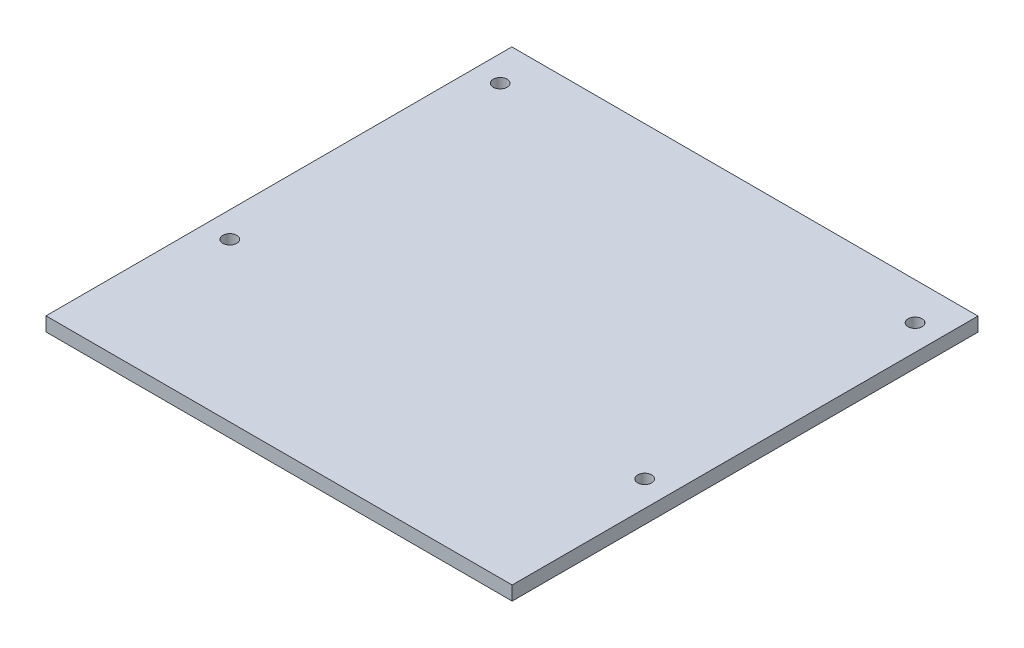
ISO-10303-21;
HEADER;
FILE_DESCRIPTION(('STEP AP214'),'2;1');
FILE_NAME('part.step','',(''),(''),'','','');
FILE_SCHEMA(('AUTOMOTIVE_DESIGN { 1 0 10303 214 1 1 1 1 }'));
ENDSEC;
DATA;
#1=APPLICATION_CONTEXT('core data for automotive mechanical design processes');
#2=APPLICATION_PROTOCOL_DEFINITION('international standard','automotive_design',2000,#1);
#3=PRODUCT_CONTEXT('',#1,'mechanical');
#4=PRODUCT('Part','Part','',(#3));
#5=PRODUCT_RELATED_PRODUCT_CATEGORY('part','',(#4));
#6=PRODUCT_DEFINITION_FORMATION('','',#4);
#7=PRODUCT_DEFINITION_CONTEXT('part definition',#1,'design');
#8=PRODUCT_DEFINITION('design','',#6,#7);
#9=PRODUCT_DEFINITION_SHAPE('','',#8);
#10=(LENGTH_UNIT() NAMED_UNIT(*) SI_UNIT(.MILLI.,.METRE.));
#11=(NAMED_UNIT(*) PLANE_ANGLE_UNIT() SI_UNIT($,.RADIAN.));
#12=(NAMED_UNIT(*) SI_UNIT($,.STERADIAN.) SOLID_ANGLE_UNIT());
#13=UNCERTAINTY_MEASURE_WITH_UNIT(LENGTH_MEASURE(1.E-05),#10,'distance_accuracy_value','');
#14=(GEOMETRIC_REPRESENTATION_CONTEXT(3) GLOBAL_UNCERTAINTY_ASSIGNED_CONTEXT((#13)) GLOBAL_UNIT_ASSIGNED_CONTEXT((#10,
#11,#12)) REPRESENTATION_CONTEXT('',''));
#15=CARTESIAN_POINT('',(0.,0.,0.));
#16=DIRECTION('',(0.,0.,1.));
#17=DIRECTION('',(1.,0.,0.));
#18=AXIS2_PLACEMENT_3D('',#15,#16,#17);
#19=CARTESIAN_POINT('',(-50.,3.,0.));
#20=DIRECTION('',(-1.,0.,0.));
#21=DIRECTION('',(0.,0.,1.));
#22=AXIS2_PLACEMENT_3D('',#19,#20,#21);
#23=PLANE('',#22);
#24=DIRECTION('',(0.,0.,-1.));
#25=VECTOR('',#24,1.);
#26=CARTESIAN_POINT('',(-50.,0.,0.));
#27=LINE('',#26,#25);
#28=CARTESIAN_POINT('',(-50.,0.,4.46357158762531));
#29=VERTEX_POINT('',#28);
#30=CARTESIAN_POINT('',(-50.,0.,-95.4635715876253));
#31=VERTEX_POINT('',#30);
#32=EDGE_CURVE('E109',#29,#31,#27,.T.);
#33=ORIENTED_EDGE('',*,*,#32,.F.);
#34=DIRECTION('',(0.,-1.,0.));
#35=VECTOR('',#34,1.);
#36=CARTESIAN_POINT('',(-50.,3.,4.46357158762531));
#37=LINE('',#36,#35);
#38=CARTESIAN_POINT('',(-50.,3.,4.46357158762531));
#39=VERTEX_POINT('',#38);
#40=EDGE_CURVE('E11',#39,#29,#37,.T.);
#41=ORIENTED_EDGE('',*,*,#40,.F.);
#42=DIRECTION('',(0.,0.,-1.));
#43=VECTOR('',#42,1.);
#44=CARTESIAN_POINT('',(-50.,3.,0.));
#45=LINE('',#44,#43);
#46=CARTESIAN_POINT('',(-50.,3.,-95.4635715876253));
#47=VERTEX_POINT('',#46);
#48=EDGE_CURVE('E102',#39,#47,#45,.T.);
#49=ORIENTED_EDGE('',*,*,#48,.T.);
#50=DIRECTION('',(0.,1.,0.));
#51=VECTOR('',#50,1.);
#52=CARTESIAN_POINT('',(-50.,0.,-95.4635715876253));
#53=LINE('',#52,#51);
#54=EDGE_CURVE('E114',#31,#47,#53,.T.);
#55=ORIENTED_EDGE('',*,*,#54,.F.);
#56=EDGE_LOOP('',(#33,#41,#49,#55));
#57=FACE_BOUND('',#56,.T.);
#58=ADVANCED_FACE('F51',(#57),#23,.T.);
#59=CARTESIAN_POINT('',(0.,3.,4.46357158762531));
#60=DIRECTION('',(0.,0.,-1.));
#61=DIRECTION('',(-1.,0.,0.));
#62=AXIS2_PLACEMENT_3D('',#59,#60,#61);
#63=PLANE('',#62);
#64=DIRECTION('',(1.,0.,0.));
#65=VECTOR('',#64,1.);
#66=CARTESIAN_POINT('',(0.,0.,4.46357158762531));
#67=LINE('',#66,#65);
#68=CARTESIAN_POINT('',(50.,0.,4.46357158762531));
#69=VERTEX_POINT('',#68);
#70=EDGE_CURVE('E103',#29,#69,#67,.T.);
#71=ORIENTED_EDGE('',*,*,#70,.T.);
#72=DIRECTION('',(0.,-1.,0.));
#73=VECTOR('',#72,1.);
#74=CARTESIAN_POINT('',(50.,3.,4.46357158762531));
#75=LINE('',#74,#73);
#76=CARTESIAN_POINT('',(50.,3.,4.46357158762531));
#77=VERTEX_POINT('',#76);
#78=EDGE_CURVE('E60',#77,#69,#75,.T.);
#79=ORIENTED_EDGE('',*,*,#78,.F.);
#80=DIRECTION('',(1.,0.,0.));
#81=VECTOR('',#80,1.);
#82=CARTESIAN_POINT('',(0.,3.,4.46357158762531));
#83=LINE('',#82,#81);
#84=EDGE_CURVE('E68',#39,#77,#83,.T.);
#85=ORIENTED_EDGE('',*,*,#84,.F.);
#86=ORIENTED_EDGE('',*,*,#40,.T.);
#87=EDGE_LOOP('',(#71,#79,#85,#86));
#88=FACE_BOUND('',#87,.T.);
#89=ADVANCED_FACE('F216',(#88),#63,.F.);
#90=CARTESIAN_POINT('',(50.,3.,0.));
#91=DIRECTION('',(-1.,0.,0.));
#92=DIRECTION('',(0.,0.,1.));
#93=AXIS2_PLACEMENT_3D('',#90,#91,#92);
#94=PLANE('',#93);
#95=DIRECTION('',(0.,0.,-1.));
#96=VECTOR('',#95,1.);
#97=CARTESIAN_POINT('',(50.,0.,0.));
#98=LINE('',#97,#96);
#99=CARTESIAN_POINT('',(50.,0.,-95.4635715876253));
#100=VERTEX_POINT('',#99);
#101=EDGE_CURVE('E95',#69,#100,#98,.T.);
#102=ORIENTED_EDGE('',*,*,#101,.T.);
#103=DIRECTION('',(0.,-1.,0.));
#104=VECTOR('',#103,1.);
#105=CARTESIAN_POINT('',(50.,0.,-95.4635715876253));
#106=LINE('',#105,#104);
#107=CARTESIAN_POINT('',(50.,3.,-95.4635715876253));
#108=VERTEX_POINT('',#107);
#109=EDGE_CURVE('E99',#108,#100,#106,.T.);
#110=ORIENTED_EDGE('',*,*,#109,.F.);
#111=DIRECTION('',(0.,0.,-1.));
#112=VECTOR('',#111,1.);
#113=CARTESIAN_POINT('',(50.,3.,0.));
#114=LINE('',#113,#112);
#115=EDGE_CURVE('E81',#77,#108,#114,.T.);
#116=ORIENTED_EDGE('',*,*,#115,.F.);
#117=ORIENTED_EDGE('',*,*,#78,.T.);
#118=EDGE_LOOP('',(#102,#110,#116,#117));
#119=FACE_BOUND('',#118,.T.);
#120=ADVANCED_FACE('F97',(#119),#94,.F.);
#121=CARTESIAN_POINT('',(0.,3.,0.));
#122=DIRECTION('',(0.,1.,0.));
#123=DIRECTION('',(0.,0.,1.));
#124=AXIS2_PLACEMENT_3D('',#121,#122,#123);
#125=PLANE('',#124);
#126=CARTESIAN_POINT('',(44.5,3.,-87.4635715876253));
#127=DIRECTION('',(0.,1.,0.));
#128=DIRECTION('',(0.,0.,1.));
#129=AXIS2_PLACEMENT_3D('',#126,#127,#128);
#130=CIRCLE('',#129,1.5);
#131=CARTESIAN_POINT('',(44.5,3.,-85.9635715876253));
#132=VERTEX_POINT('',#131);
#133=EDGE_CURVE('E154',#132,#132,#130,.T.);
#134=ORIENTED_EDGE('',*,*,#133,.F.);
#135=EDGE_LOOP('',(#134));
#136=FACE_BOUND('',#135,.T.);
#137=CARTESIAN_POINT('',(-44.5,3.,-29.4635715876253));
#138=DIRECTION('',(0.,1.,0.));
#139=DIRECTION('',(0.,0.,1.));
#140=AXIS2_PLACEMENT_3D('',#137,#138,#139);
#141=CIRCLE('',#140,1.5);
#142=CARTESIAN_POINT('',(-44.5,3.,-27.9635715876253));
#143=VERTEX_POINT('',#142);
#144=EDGE_CURVE('E176',#143,#143,#141,.T.);
#145=ORIENTED_EDGE('',*,*,#144,.F.);
#146=EDGE_LOOP('',(#145));
#147=FACE_BOUND('',#146,.T.);
#148=CARTESIAN_POINT('',(44.5,3.,-29.4635715876253));
#149=DIRECTION('',(0.,1.,0.));
#150=DIRECTION('',(0.,0.,1.));
#151=AXIS2_PLACEMENT_3D('',#148,#149,#150);
#152=CIRCLE('',#151,1.5);
#153=CARTESIAN_POINT('',(44.5,3.,-27.9635715876253));
#154=VERTEX_POINT('',#153);
#155=EDGE_CURVE('E161',#154,#154,#152,.T.);
#156=ORIENTED_EDGE('',*,*,#155,.F.);
#157=EDGE_LOOP('',(#156));
#158=FACE_BOUND('',#157,.T.);
#159=CARTESIAN_POINT('',(-44.5,3.,-87.4635715876253));
#160=DIRECTION('',(0.,1.,0.));
#161=DIRECTION('',(0.,0.,1.));
#162=AXIS2_PLACEMENT_3D('',#159,#160,#161);
#163=CIRCLE('',#162,1.5);
#164=CARTESIAN_POINT('',(-44.5,3.,-85.9635715876253));
#165=VERTEX_POINT('',#164);
#166=EDGE_CURVE('E126',#165,#165,#163,.T.);
#167=ORIENTED_EDGE('',*,*,#166,.F.);
#168=EDGE_LOOP('',(#167));
#169=FACE_BOUND('',#168,.T.);
#170=ORIENTED_EDGE('',*,*,#115,.T.);
#171=DIRECTION('',(1.,0.,0.));
#172=VECTOR('',#171,1.);
#173=CARTESIAN_POINT('',(50.,3.,-95.4635715876253));
#174=LINE('',#173,#172);
#175=EDGE_CURVE('E117',#47,#108,#174,.T.);
#176=ORIENTED_EDGE('',*,*,#175,.F.);
#177=ORIENTED_EDGE('',*,*,#48,.F.);
#178=ORIENTED_EDGE('',*,*,#84,.T.);
#179=EDGE_LOOP('',(#170,#176,#177,#178));
#180=FACE_BOUND('',#179,.T.);
#181=ADVANCED_FACE('F193',(#136,#147,#158,#169,#180),#125,.T.);
#182=CARTESIAN_POINT('',(0.,0.,0.));
#183=DIRECTION('',(0.,1.,0.));
#184=DIRECTION('',(0.,0.,1.));
#185=AXIS2_PLACEMENT_3D('',#182,#183,#184);
#186=PLANE('',#185);
#187=CARTESIAN_POINT('',(44.5,0.,-87.4635715876253));
#188=DIRECTION('',(0.,1.,0.));
#189=DIRECTION('',(0.,0.,1.));
#190=AXIS2_PLACEMENT_3D('',#187,#188,#189);
#191=CIRCLE('',#190,1.5);
#192=CARTESIAN_POINT('',(44.5,0.,-85.9635715876253));
#193=VERTEX_POINT('',#192);
#194=EDGE_CURVE('E179',#193,#193,#191,.T.);
#195=ORIENTED_EDGE('',*,*,#194,.T.);
#196=EDGE_LOOP('',(#195));
#197=FACE_BOUND('',#196,.T.);
#198=CARTESIAN_POINT('',(-44.5,0.,-29.4635715876253));
#199=DIRECTION('',(0.,1.,0.));
#200=DIRECTION('',(0.,0.,1.));
#201=AXIS2_PLACEMENT_3D('',#198,#199,#200);
#202=CIRCLE('',#201,1.5);
#203=CARTESIAN_POINT('',(-44.5,0.,-27.9635715876253));
#204=VERTEX_POINT('',#203);
#205=EDGE_CURVE('E171',#204,#204,#202,.T.);
#206=ORIENTED_EDGE('',*,*,#205,.T.);
#207=EDGE_LOOP('',(#206));
#208=FACE_BOUND('',#207,.T.);
#209=CARTESIAN_POINT('',(44.5,0.,-29.4635715876253));
#210=DIRECTION('',(0.,1.,0.));
#211=DIRECTION('',(0.,0.,1.));
#212=AXIS2_PLACEMENT_3D('',#209,#210,#211);
#213=CIRCLE('',#212,1.5);
#214=CARTESIAN_POINT('',(44.5,0.,-27.9635715876253));
#215=VERTEX_POINT('',#214);
#216=EDGE_CURVE('E158',#215,#215,#213,.T.);
#217=ORIENTED_EDGE('',*,*,#216,.T.);
#218=EDGE_LOOP('',(#217));
#219=FACE_BOUND('',#218,.T.);
#220=CARTESIAN_POINT('',(-44.5,0.,-87.4635715876253));
#221=DIRECTION('',(0.,1.,0.));
#222=DIRECTION('',(0.,0.,1.));
#223=AXIS2_PLACEMENT_3D('',#220,#221,#222);
#224=CIRCLE('',#223,1.5);
#225=CARTESIAN_POINT('',(-44.5,0.,-85.9635715876253));
#226=VERTEX_POINT('',#225);
#227=EDGE_CURVE('E119',#226,#226,#224,.T.);
#228=ORIENTED_EDGE('',*,*,#227,.T.);
#229=EDGE_LOOP('',(#228));
#230=FACE_BOUND('',#229,.T.);
#231=ORIENTED_EDGE('',*,*,#32,.T.);
#232=DIRECTION('',(-1.,0.,0.));
#233=VECTOR('',#232,1.);
#234=CARTESIAN_POINT('',(50.,0.,-95.4635715876253));
#235=LINE('',#234,#233);
#236=EDGE_CURVE('E106',#100,#31,#235,.T.);
#237=ORIENTED_EDGE('',*,*,#236,.F.);
#238=ORIENTED_EDGE('',*,*,#101,.F.);
#239=ORIENTED_EDGE('',*,*,#70,.F.);
#240=EDGE_LOOP('',(#231,#237,#238,#239));
#241=FACE_BOUND('',#240,.T.);
#242=ADVANCED_FACE('F107',(#197,#208,#219,#230,#241),#186,.F.);
#243=CARTESIAN_POINT('',(0.,0.,-95.4635715876253));
#244=DIRECTION('',(0.,0.,1.));
#245=DIRECTION('',(1.,0.,0.));
#246=AXIS2_PLACEMENT_3D('',#243,#244,#245);
#247=PLANE('',#246);
#248=ORIENTED_EDGE('',*,*,#109,.T.);
#249=ORIENTED_EDGE('',*,*,#236,.T.);
#250=ORIENTED_EDGE('',*,*,#54,.T.);
#251=ORIENTED_EDGE('',*,*,#175,.T.);
#252=EDGE_LOOP('',(#248,#249,#250,#251));
#253=FACE_BOUND('',#252,.T.);
#254=ADVANCED_FACE('F116',(#253),#247,.F.);
#255=CARTESIAN_POINT('',(-44.5,0.,-87.4635715876253));
#256=DIRECTION('',(0.,1.,0.));
#257=DIRECTION('',(0.,0.,1.));
#258=AXIS2_PLACEMENT_3D('',#255,#256,#257);
#259=CYLINDRICAL_SURFACE('',#258,1.5);
#260=ORIENTED_EDGE('',*,*,#227,.F.);
#261=EDGE_LOOP('',(#260));
#262=FACE_BOUND('',#261,.T.);
#263=ORIENTED_EDGE('',*,*,#166,.T.);
#264=EDGE_LOOP('',(#263));
#265=FACE_BOUND('',#264,.T.);
#266=ADVANCED_FACE('F202',(#262,#265),#259,.F.);
#267=CARTESIAN_POINT('',(44.5,0.,-29.4635715876253));
#268=DIRECTION('',(0.,1.,0.));
#269=DIRECTION('',(0.,0.,1.));
#270=AXIS2_PLACEMENT_3D('',#267,#268,#269);
#271=CYLINDRICAL_SURFACE('',#270,1.5);
#272=ORIENTED_EDGE('',*,*,#216,.F.);
#273=EDGE_LOOP('',(#272));
#274=FACE_BOUND('',#273,.T.);
#275=ORIENTED_EDGE('',*,*,#155,.T.);
#276=EDGE_LOOP('',(#275));
#277=FACE_BOUND('',#276,.T.);
#278=ADVANCED_FACE('F204',(#274,#277),#271,.F.);
#279=CARTESIAN_POINT('',(-44.5,0.,-29.4635715876253));
#280=DIRECTION('',(0.,1.,0.));
#281=DIRECTION('',(0.,0.,1.));
#282=AXIS2_PLACEMENT_3D('',#279,#280,#281);
#283=CYLINDRICAL_SURFACE('',#282,1.5);
#284=ORIENTED_EDGE('',*,*,#205,.F.);
#285=EDGE_LOOP('',(#284));
#286=FACE_BOUND('',#285,.T.);
#287=ORIENTED_EDGE('',*,*,#144,.T.);
#288=EDGE_LOOP('',(#287));
#289=FACE_BOUND('',#288,.T.);
#290=ADVANCED_FACE('F191',(#286,#289),#283,.F.);
#291=CARTESIAN_POINT('',(44.5,0.,-87.4635715876253));
#292=DIRECTION('',(0.,1.,0.));
#293=DIRECTION('',(0.,0.,1.));
#294=AXIS2_PLACEMENT_3D('',#291,#292,#293);
#295=CYLINDRICAL_SURFACE('',#294,1.5);
#296=ORIENTED_EDGE('',*,*,#194,.F.);
#297=EDGE_LOOP('',(#296));
#298=FACE_BOUND('',#297,.T.);
#299=ORIENTED_EDGE('',*,*,#133,.T.);
#300=EDGE_LOOP('',(#299));
#301=FACE_BOUND('',#300,.T.);
#302=ADVANCED_FACE('F236',(#298,#301),#295,.F.);
#303=CLOSED_SHELL('',(#58,#89,#120,#181,#242,#254,#266,#278,#290,#302));
#304=MANIFOLD_SOLID_BREP('B2',#303);
#305=ADVANCED_BREP_SHAPE_REPRESENTATION('',(#18,#304),#14);
#306=SHAPE_DEFINITION_REPRESENTATION(#9,#305);
ENDSEC;
END-ISO-10303-21;
